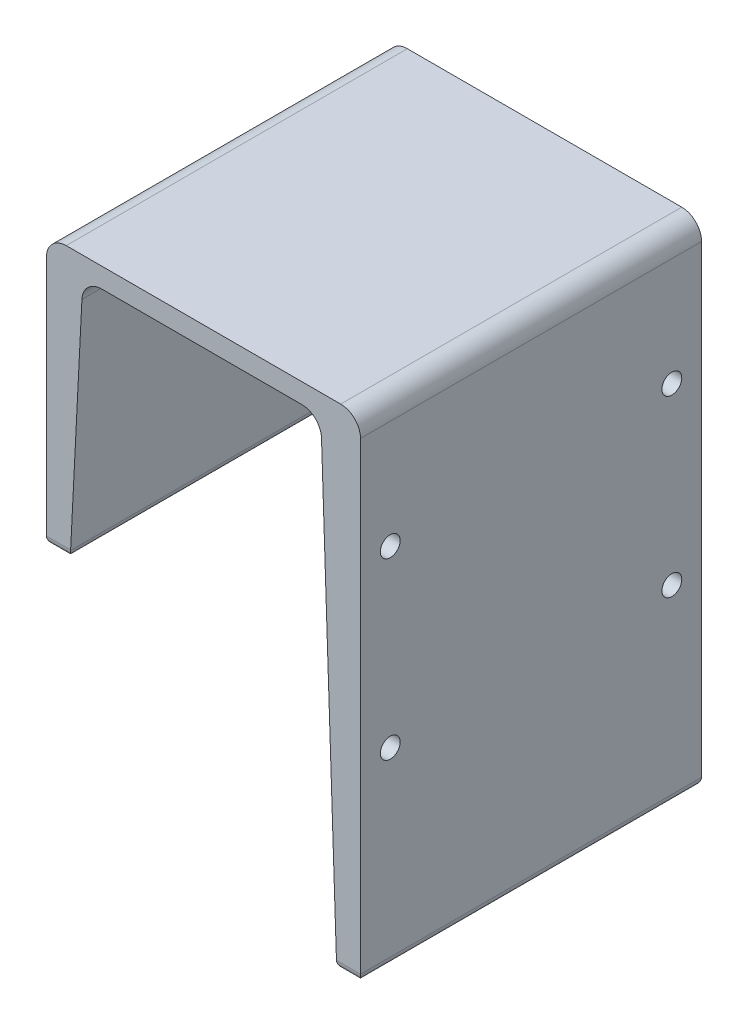
ISO-10303-21;
HEADER;
FILE_DESCRIPTION(('STEP AP214'),'2;1');
FILE_NAME('part.step','',(''),(''),'','','');
FILE_SCHEMA(('AUTOMOTIVE_DESIGN { 1 0 10303 214 1 1 1 1 }'));
ENDSEC;
DATA;
#1=APPLICATION_CONTEXT('core data for automotive mechanical design processes');
#2=APPLICATION_PROTOCOL_DEFINITION('international standard','automotive_design',2000,#1);
#3=PRODUCT_CONTEXT('',#1,'mechanical');
#4=PRODUCT('Part','Part','',(#3));
#5=PRODUCT_RELATED_PRODUCT_CATEGORY('part','',(#4));
#6=PRODUCT_DEFINITION_FORMATION('','',#4);
#7=PRODUCT_DEFINITION_CONTEXT('part definition',#1,'design');
#8=PRODUCT_DEFINITION('design','',#6,#7);
#9=PRODUCT_DEFINITION_SHAPE('','',#8);
#10=(LENGTH_UNIT() NAMED_UNIT(*) SI_UNIT(.MILLI.,.METRE.));
#11=(NAMED_UNIT(*) PLANE_ANGLE_UNIT() SI_UNIT($,.RADIAN.));
#12=(NAMED_UNIT(*) SI_UNIT($,.STERADIAN.) SOLID_ANGLE_UNIT());
#13=UNCERTAINTY_MEASURE_WITH_UNIT(LENGTH_MEASURE(1.E-05),#10,'distance_accuracy_value','');
#14=(GEOMETRIC_REPRESENTATION_CONTEXT(3) GLOBAL_UNCERTAINTY_ASSIGNED_CONTEXT((#13)) GLOBAL_UNIT_ASSIGNED_CONTEXT((#10,
#11,#12)) REPRESENTATION_CONTEXT('',''));
#15=CARTESIAN_POINT('',(0.,0.,0.));
#16=DIRECTION('',(0.,0.,1.));
#17=DIRECTION('',(1.,0.,0.));
#18=AXIS2_PLACEMENT_3D('',#15,#16,#17);
#19=CARTESIAN_POINT('',(0.,0.,-43.));
#20=DIRECTION('',(0.,-1.,0.));
#21=DIRECTION('',(1.,0.,0.));
#22=AXIS2_PLACEMENT_3D('',#19,#20,#21);
#23=PLANE('',#22);
#24=DIRECTION('',(0.,0.,1.));
#25=VECTOR('',#24,1.);
#26=CARTESIAN_POINT('',(-2.,0.,-43.));
#27=LINE('',#26,#25);
#28=CARTESIAN_POINT('',(-2.,0.,-1.));
#29=VERTEX_POINT('',#28);
#30=CARTESIAN_POINT('',(-2.,0.,-42.));
#31=VERTEX_POINT('',#30);
#32=EDGE_CURVE('E232',#29,#31,#27,.F.);
#33=ORIENTED_EDGE('',*,*,#32,.T.);
#34=DIRECTION('',(1.,0.,0.));
#35=VECTOR('',#34,1.);
#36=CARTESIAN_POINT('',(0.,0.,-42.));
#37=LINE('',#36,#35);
#38=CARTESIAN_POINT('',(-0.950432502618614,0.,-42.));
#39=VERTEX_POINT('',#38);
#40=EDGE_CURVE('E234',#31,#39,#37,.T.);
#41=ORIENTED_EDGE('',*,*,#40,.T.);
#42=DIRECTION('',(0.,0.,1.));
#43=VECTOR('',#42,1.);
#44=CARTESIAN_POINT('',(-0.950432502618614,0.,-43.));
#45=LINE('',#44,#43);
#46=CARTESIAN_POINT('',(-0.950432502618614,0.,-1.));
#47=VERTEX_POINT('',#46);
#48=EDGE_CURVE('E230',#39,#47,#45,.T.);
#49=ORIENTED_EDGE('',*,*,#48,.T.);
#50=DIRECTION('',(1.,0.,0.));
#51=VECTOR('',#50,1.);
#52=CARTESIAN_POINT('',(-3.,0.,-1.));
#53=LINE('',#52,#51);
#54=EDGE_CURVE('E228',#47,#29,#53,.F.);
#55=ORIENTED_EDGE('',*,*,#54,.T.);
#56=EDGE_LOOP('',(#33,#41,#49,#55));
#57=FACE_BOUND('',#56,.T.);
#58=ADVANCED_FACE('F37',(#57),#23,.T.);
#59=CARTESIAN_POINT('',(-3.,0.,-43.));
#60=DIRECTION('',(-1.,0.,0.));
#61=DIRECTION('',(0.,0.,1.));
#62=AXIS2_PLACEMENT_3D('',#59,#60,#61);
#63=PLANE('',#62);
#64=DIRECTION('',(0.,-1.,0.));
#65=VECTOR('',#64,1.);
#66=CARTESIAN_POINT('',(-3.,0.,-43.));
#67=LINE('',#66,#65);
#68=CARTESIAN_POINT('',(-3.,31.4588860426372,-43.));
#69=VERTEX_POINT('',#68);
#70=CARTESIAN_POINT('',(-3.,1.,-43.));
#71=VERTEX_POINT('',#70);
#72=EDGE_CURVE('E191',#69,#71,#67,.T.);
#73=ORIENTED_EDGE('',*,*,#72,.T.);
#74=DIRECTION('',(0.,0.,1.));
#75=VECTOR('',#74,1.);
#76=CARTESIAN_POINT('',(-3.,1.,-43.));
#77=LINE('',#76,#75);
#78=CARTESIAN_POINT('',(-3.,1.,0.));
#79=VERTEX_POINT('',#78);
#80=EDGE_CURVE('E246',#71,#79,#77,.T.);
#81=ORIENTED_EDGE('',*,*,#80,.T.);
#82=DIRECTION('',(0.,-1.,0.));
#83=VECTOR('',#82,1.);
#84=CARTESIAN_POINT('',(-3.,0.,0.));
#85=LINE('',#84,#83);
#86=CARTESIAN_POINT('',(-3.,31.4588860426372,0.));
#87=VERTEX_POINT('',#86);
#88=EDGE_CURVE('E199',#87,#79,#85,.T.);
#89=ORIENTED_EDGE('',*,*,#88,.F.);
#90=DIRECTION('',(0.,0.,1.));
#91=VECTOR('',#90,1.);
#92=CARTESIAN_POINT('',(-3.,31.4588860426372,-43.));
#93=LINE('',#92,#91);
#94=EDGE_CURVE('E218',#87,#69,#93,.F.);
#95=ORIENTED_EDGE('',*,*,#94,.T.);
#96=EDGE_LOOP('',(#73,#81,#89,#95));
#97=FACE_BOUND('',#96,.T.);
#98=ADVANCED_FACE('F334',(#97),#63,.T.);
#99=CARTESIAN_POINT('',(-3.,33.9588860426372,-43.));
#100=DIRECTION('',(0.,1.,0.));
#101=DIRECTION('',(0.,0.,1.));
#102=AXIS2_PLACEMENT_3D('',#99,#100,#101);
#103=PLANE('',#102);
#104=DIRECTION('',(-1.,0.,0.));
#105=VECTOR('',#104,1.);
#106=CARTESIAN_POINT('',(-3.,33.9588860426372,-43.));
#107=LINE('',#106,#105);
#108=CARTESIAN_POINT('',(34.1,33.9588860426372,-43.));
#109=VERTEX_POINT('',#108);
#110=CARTESIAN_POINT('',(-0.5,33.9588860426372,-43.));
#111=VERTEX_POINT('',#110);
#112=EDGE_CURVE('E196',#109,#111,#107,.T.);
#113=ORIENTED_EDGE('',*,*,#112,.T.);
#114=DIRECTION('',(0.,0.,1.));
#115=VECTOR('',#114,1.);
#116=CARTESIAN_POINT('',(-0.5,33.9588860426372,-43.));
#117=LINE('',#116,#115);
#118=CARTESIAN_POINT('',(-0.5,33.9588860426372,0.));
#119=VERTEX_POINT('',#118);
#120=EDGE_CURVE('E211',#111,#119,#117,.T.);
#121=ORIENTED_EDGE('',*,*,#120,.T.);
#122=DIRECTION('',(-1.,0.,0.));
#123=VECTOR('',#122,1.);
#124=CARTESIAN_POINT('',(-3.,33.9588860426372,0.));
#125=LINE('',#124,#123);
#126=CARTESIAN_POINT('',(34.1,33.9588860426372,0.));
#127=VERTEX_POINT('',#126);
#128=EDGE_CURVE('E304',#127,#119,#125,.T.);
#129=ORIENTED_EDGE('',*,*,#128,.F.);
#130=DIRECTION('',(0.,0.,1.));
#131=VECTOR('',#130,1.);
#132=CARTESIAN_POINT('',(34.1,33.9588860426372,-43.));
#133=LINE('',#132,#131);
#134=EDGE_CURVE('E209',#127,#109,#133,.F.);
#135=ORIENTED_EDGE('',*,*,#134,.T.);
#136=EDGE_LOOP('',(#113,#121,#129,#135));
#137=FACE_BOUND('',#136,.T.);
#138=ADVANCED_FACE('F325',(#137),#103,.T.);
#139=CARTESIAN_POINT('',(36.6,33.9588860426372,-43.));
#140=DIRECTION('',(1.,0.,0.));
#141=DIRECTION('',(0.,1.,0.));
#142=AXIS2_PLACEMENT_3D('',#139,#140,#141);
#143=PLANE('',#142);
#144=CARTESIAN_POINT('',(36.6,17.8190527217371,-3.75));
#145=DIRECTION('',(1.,0.,0.));
#146=DIRECTION('',(0.,-1.,0.));
#147=AXIS2_PLACEMENT_3D('',#144,#145,#146);
#148=CIRCLE('',#147,1.25);
#149=CARTESIAN_POINT('',(36.6,16.5690527217371,-3.75));
#150=VERTEX_POINT('',#149);
#151=EDGE_CURVE('E591',#150,#150,#148,.T.);
#152=ORIENTED_EDGE('',*,*,#151,.F.);
#153=EDGE_LOOP('',(#152));
#154=FACE_BOUND('',#153,.T.);
#155=CARTESIAN_POINT('',(36.6,-4.18094727826294,-3.75));
#156=DIRECTION('',(1.,0.,0.));
#157=DIRECTION('',(0.,-1.,0.));
#158=AXIS2_PLACEMENT_3D('',#155,#156,#157);
#159=CIRCLE('',#158,1.25);
#160=CARTESIAN_POINT('',(36.6,-5.43094727826295,-3.75));
#161=VERTEX_POINT('',#160);
#162=EDGE_CURVE('E599',#161,#161,#159,.T.);
#163=ORIENTED_EDGE('',*,*,#162,.F.);
#164=EDGE_LOOP('',(#163));
#165=FACE_BOUND('',#164,.T.);
#166=CARTESIAN_POINT('',(36.6,-4.18094727826294,-39.25));
#167=DIRECTION('',(1.,0.,0.));
#168=DIRECTION('',(0.,1.,0.));
#169=AXIS2_PLACEMENT_3D('',#166,#167,#168);
#170=CIRCLE('',#169,1.25);
#171=CARTESIAN_POINT('',(36.6,-2.93094727826293,-39.25));
#172=VERTEX_POINT('',#171);
#173=EDGE_CURVE('E585',#172,#172,#170,.T.);
#174=ORIENTED_EDGE('',*,*,#173,.F.);
#175=EDGE_LOOP('',(#174));
#176=FACE_BOUND('',#175,.T.);
#177=CARTESIAN_POINT('',(36.6,17.8190527217371,-39.25));
#178=DIRECTION('',(1.,0.,0.));
#179=DIRECTION('',(0.,1.,0.));
#180=AXIS2_PLACEMENT_3D('',#177,#178,#179);
#181=CIRCLE('',#180,1.25);
#182=CARTESIAN_POINT('',(36.6,19.0690527217371,-39.25));
#183=VERTEX_POINT('',#182);
#184=EDGE_CURVE('E174',#183,#183,#181,.T.);
#185=ORIENTED_EDGE('',*,*,#184,.F.);
#186=EDGE_LOOP('',(#185));
#187=FACE_BOUND('',#186,.T.);
#188=DIRECTION('',(0.,1.,0.));
#189=VECTOR('',#188,1.);
#190=CARTESIAN_POINT('',(36.6,33.9588860426372,0.));
#191=LINE('',#190,#189);
#192=CARTESIAN_POINT('',(36.6,-27.0411139573628,0.));
#193=VERTEX_POINT('',#192);
#194=CARTESIAN_POINT('',(36.6,31.4588860426372,0.));
#195=VERTEX_POINT('',#194);
#196=EDGE_CURVE('E302',#193,#195,#191,.T.);
#197=ORIENTED_EDGE('',*,*,#196,.F.);
#198=DIRECTION('',(0.,0.,1.));
#199=VECTOR('',#198,1.);
#200=CARTESIAN_POINT('',(36.6,-27.0411139573628,-43.));
#201=LINE('',#200,#199);
#202=CARTESIAN_POINT('',(36.6,-27.0411139573628,-43.));
#203=VERTEX_POINT('',#202);
#204=EDGE_CURVE('E11',#193,#203,#201,.F.);
#205=ORIENTED_EDGE('',*,*,#204,.T.);
#206=DIRECTION('',(0.,1.,0.));
#207=VECTOR('',#206,1.);
#208=CARTESIAN_POINT('',(36.6,33.9588860426372,-43.));
#209=LINE('',#208,#207);
#210=CARTESIAN_POINT('',(36.6,31.4588860426372,-43.));
#211=VERTEX_POINT('',#210);
#212=EDGE_CURVE('E319',#203,#211,#209,.T.);
#213=ORIENTED_EDGE('',*,*,#212,.T.);
#214=DIRECTION('',(0.,0.,1.));
#215=VECTOR('',#214,1.);
#216=CARTESIAN_POINT('',(36.6,31.4588860426372,-43.));
#217=LINE('',#216,#215);
#218=EDGE_CURVE('E225',#211,#195,#217,.T.);
#219=ORIENTED_EDGE('',*,*,#218,.T.);
#220=EDGE_LOOP('',(#197,#205,#213,#219));
#221=FACE_BOUND('',#220,.T.);
#222=ADVANCED_FACE('F405',(#154,#165,#176,#187,#221),#143,.T.);
#223=CARTESIAN_POINT('',(36.6,-28.0411139573628,-43.));
#224=DIRECTION('',(0.,-1.,0.));
#225=DIRECTION('',(0.,0.,-1.));
#226=AXIS2_PLACEMENT_3D('',#223,#224,#225);
#227=PLANE('',#226);
#228=DIRECTION('',(1.,0.,0.));
#229=VECTOR('',#228,1.);
#230=CARTESIAN_POINT('',(33.6,-28.0411139573628,-1.));
#231=LINE('',#230,#229);
#232=CARTESIAN_POINT('',(35.6,-28.0411139573628,-1.));
#233=VERTEX_POINT('',#232);
#234=CARTESIAN_POINT('',(34.566951326993,-28.0411139573628,-1.));
#235=VERTEX_POINT('',#234);
#236=EDGE_CURVE('E262',#233,#235,#231,.F.);
#237=ORIENTED_EDGE('',*,*,#236,.T.);
#238=DIRECTION('',(0.,0.,1.));
#239=VECTOR('',#238,1.);
#240=CARTESIAN_POINT('',(34.566951326993,-28.0411139573628,-43.));
#241=LINE('',#240,#239);
#242=CARTESIAN_POINT('',(34.566951326993,-28.0411139573628,-42.));
#243=VERTEX_POINT('',#242);
#244=EDGE_CURVE('E267',#235,#243,#241,.F.);
#245=ORIENTED_EDGE('',*,*,#244,.T.);
#246=DIRECTION('',(1.,0.,0.));
#247=VECTOR('',#246,1.);
#248=CARTESIAN_POINT('',(36.6,-28.0411139573628,-42.));
#249=LINE('',#248,#247);
#250=CARTESIAN_POINT('',(35.6,-28.0411139573628,-42.));
#251=VERTEX_POINT('',#250);
#252=EDGE_CURVE('E264',#243,#251,#249,.T.);
#253=ORIENTED_EDGE('',*,*,#252,.T.);
#254=DIRECTION('',(0.,0.,1.));
#255=VECTOR('',#254,1.);
#256=CARTESIAN_POINT('',(35.6,-28.0411139573628,-43.));
#257=LINE('',#256,#255);
#258=EDGE_CURVE('E249',#251,#233,#257,.T.);
#259=ORIENTED_EDGE('',*,*,#258,.T.);
#260=EDGE_LOOP('',(#237,#245,#253,#259));
#261=FACE_BOUND('',#260,.T.);
#262=ADVANCED_FACE('F403',(#261),#227,.T.);
#263=CARTESIAN_POINT('',(31.6,31.4588860426372,-43.));
#264=DIRECTION('',(-0.999435546416609,-0.0335944721484575,0.));
#265=DIRECTION('',(0.0335944721484575,-0.999435546416609,0.));
#266=AXIS2_PLACEMENT_3D('',#263,#264,#265);
#267=PLANE('',#266);
#268=DIRECTION('',(0.0335944721484575,-0.999435546416609,0.));
#269=VECTOR('',#268,1.);
#270=CARTESIAN_POINT('',(31.6,31.4588860426372,-43.));
#271=LINE('',#270,#269);
#272=CARTESIAN_POINT('',(31.681210548559,29.0428722230084,-43.));
#273=VERTEX_POINT('',#272);
#274=CARTESIAN_POINT('',(33.5663865546218,-27.0411139573628,-43.));
#275=VERTEX_POINT('',#274);
#276=EDGE_CURVE('E313',#273,#275,#271,.T.);
#277=ORIENTED_EDGE('',*,*,#276,.T.);
#278=CARTESIAN_POINT('',(33.5663865546218,-27.0411139573628,-42.));
#279=DIRECTION('',(-0.999435546416609,-0.0335944721484575,0.));
#280=DIRECTION('',(0.0335944721484575,-0.999435546416609,0.));
#281=AXIS2_PLACEMENT_3D('',#278,#279,#280);
#282=ELLIPSE('',#281,1.00056477237118,1.);
#283=CARTESIAN_POINT('',(33.5675157805764,-27.0747084295112,-42.9994355464166));
#284=VERTEX_POINT('',#283);
#285=EDGE_CURVE('E275',#275,#284,#282,.T.);
#286=ORIENTED_EDGE('',*,*,#285,.T.);
#287=DIRECTION('',(0.,0.,1.));
#288=VECTOR('',#287,1.);
#289=CARTESIAN_POINT('',(33.5675157805764,-27.0747084295112,-43.));
#290=LINE('',#289,#288);
#291=CARTESIAN_POINT('',(33.5675157805764,-27.0747084295112,-0.000564453583387636));
#292=VERTEX_POINT('',#291);
#293=EDGE_CURVE('E61',#284,#292,#290,.T.);
#294=ORIENTED_EDGE('',*,*,#293,.T.);
#295=CARTESIAN_POINT('',(33.5663865546218,-27.0411139573628,-1.));
#296=DIRECTION('',(-0.999435546416609,-0.0335944721484575,0.));
#297=DIRECTION('',(-0.0335944721484575,0.999435546416609,0.));
#298=AXIS2_PLACEMENT_3D('',#295,#296,#297);
#299=ELLIPSE('',#298,1.00056477237118,1.);
#300=CARTESIAN_POINT('',(33.5663865546218,-27.0411139573628,0.));
#301=VERTEX_POINT('',#300);
#302=EDGE_CURVE('E273',#292,#301,#299,.T.);
#303=ORIENTED_EDGE('',*,*,#302,.T.);
#304=DIRECTION('',(0.0335944721484575,-0.999435546416609,0.));
#305=VECTOR('',#304,1.);
#306=CARTESIAN_POINT('',(31.6,31.4588860426372,0.));
#307=LINE('',#306,#305);
#308=CARTESIAN_POINT('',(31.681210548559,29.0428722230084,0.));
#309=VERTEX_POINT('',#308);
#310=EDGE_CURVE('E300',#309,#301,#307,.T.);
#311=ORIENTED_EDGE('',*,*,#310,.F.);
#312=DIRECTION('',(0.,0.,1.));
#313=VECTOR('',#312,1.);
#314=CARTESIAN_POINT('',(31.681210548559,29.0428722230084,-43.));
#315=LINE('',#314,#313);
#316=EDGE_CURVE('E184',#309,#273,#315,.F.);
#317=ORIENTED_EDGE('',*,*,#316,.T.);
#318=EDGE_LOOP('',(#277,#286,#294,#303,#311,#317));
#319=FACE_BOUND('',#318,.T.);
#320=CARTESIAN_POINT('',(32.0584817922992,17.8190527217371,-3.75));
#321=DIRECTION('',(-0.999435546416609,-0.0335944721484575,0.));
#322=DIRECTION('',(0.0335944721484575,-0.999435546416609,0.));
#323=AXIS2_PLACEMENT_3D('',#320,#321,#322);
#324=ELLIPSE('',#323,1.25070596546398,1.25);
#325=CARTESIAN_POINT('',(32.1004985990219,16.5690527217371,-3.75));
#326=VERTEX_POINT('',#325);
#327=EDGE_CURVE('E260',#326,#326,#324,.F.);
#328=ORIENTED_EDGE('',*,*,#327,.T.);
#329=EDGE_LOOP('',(#328));
#330=FACE_BOUND('',#329,.T.);
#331=CARTESIAN_POINT('',(32.7979775906185,-4.18094727826294,-3.75));
#332=DIRECTION('',(-0.999435546416609,-0.0335944721484575,0.));
#333=DIRECTION('',(0.0335944721484575,-0.999435546416609,0.));
#334=AXIS2_PLACEMENT_3D('',#331,#332,#333);
#335=ELLIPSE('',#334,1.25070596546398,1.25);
#336=CARTESIAN_POINT('',(32.8399943973412,-5.43094727826295,-3.75));
#337=VERTEX_POINT('',#336);
#338=EDGE_CURVE('E594',#337,#337,#335,.F.);
#339=ORIENTED_EDGE('',*,*,#338,.T.);
#340=EDGE_LOOP('',(#339));
#341=FACE_BOUND('',#340,.T.);
#342=CARTESIAN_POINT('',(32.7979775906185,-4.18094727826294,-39.25));
#343=DIRECTION('',(-0.999435546416609,-0.0335944721484575,0.));
#344=DIRECTION('',(0.0335944721484575,-0.999435546416609,0.));
#345=AXIS2_PLACEMENT_3D('',#342,#343,#344);
#346=ELLIPSE('',#345,1.25070596546398,1.25);
#347=CARTESIAN_POINT('',(32.8399943973412,-5.43094727826294,-39.25));
#348=VERTEX_POINT('',#347);
#349=EDGE_CURVE('E588',#348,#348,#346,.F.);
#350=ORIENTED_EDGE('',*,*,#349,.T.);
#351=EDGE_LOOP('',(#350));
#352=FACE_BOUND('',#351,.T.);
#353=CARTESIAN_POINT('',(32.0584817922992,17.8190527217371,-39.25));
#354=DIRECTION('',(-0.999435546416609,-0.0335944721484575,0.));
#355=DIRECTION('',(0.0335944721484575,-0.999435546416609,0.));
#356=AXIS2_PLACEMENT_3D('',#353,#354,#355);
#357=ELLIPSE('',#356,1.25070596546398,1.25);
#358=CARTESIAN_POINT('',(32.1004985990219,16.5690527217371,-39.25));
#359=VERTEX_POINT('',#358);
#360=EDGE_CURVE('E581',#359,#359,#357,.F.);
#361=ORIENTED_EDGE('',*,*,#360,.T.);
#362=EDGE_LOOP('',(#361));
#363=FACE_BOUND('',#362,.T.);
#364=ADVANCED_FACE('F298',(#319,#330,#341,#352,#363),#267,.T.);
#365=CARTESIAN_POINT('',(1.6,31.4588860426372,-43.));
#366=DIRECTION('',(0.,-1.,0.));
#367=DIRECTION('',(0.,0.,-1.));
#368=AXIS2_PLACEMENT_3D('',#365,#366,#367);
#369=PLANE('',#368);
#370=DIRECTION('',(1.,0.,0.));
#371=VECTOR('',#370,1.);
#372=CARTESIAN_POINT('',(1.6,31.4588860426372,0.));
#373=LINE('',#372,#371);
#374=CARTESIAN_POINT('',(3.97608125654654,31.4588860426372,0.));
#375=VERTEX_POINT('',#374);
#376=CARTESIAN_POINT('',(29.1826216825174,31.4588860426372,0.));
#377=VERTEX_POINT('',#376);
#378=EDGE_CURVE('E173',#375,#377,#373,.T.);
#379=ORIENTED_EDGE('',*,*,#378,.F.);
#380=DIRECTION('',(0.,0.,1.));
#381=VECTOR('',#380,1.);
#382=CARTESIAN_POINT('',(3.97608125654654,31.4588860426372,-43.));
#383=LINE('',#382,#381);
#384=CARTESIAN_POINT('',(3.97608125654654,31.4588860426372,-43.));
#385=VERTEX_POINT('',#384);
#386=EDGE_CURVE('E182',#375,#385,#383,.F.);
#387=ORIENTED_EDGE('',*,*,#386,.T.);
#388=DIRECTION('',(1.,0.,0.));
#389=VECTOR('',#388,1.);
#390=CARTESIAN_POINT('',(1.6,31.4588860426372,-43.));
#391=LINE('',#390,#389);
#392=CARTESIAN_POINT('',(29.1826216825174,31.4588860426372,-43.));
#393=VERTEX_POINT('',#392);
#394=EDGE_CURVE('E310',#385,#393,#391,.T.);
#395=ORIENTED_EDGE('',*,*,#394,.T.);
#396=DIRECTION('',(0.,0.,1.));
#397=VECTOR('',#396,1.);
#398=CARTESIAN_POINT('',(29.1826216825174,31.4588860426372,0.));
#399=LINE('',#398,#397);
#400=EDGE_CURVE('E190',#393,#377,#399,.T.);
#401=ORIENTED_EDGE('',*,*,#400,.T.);
#402=EDGE_LOOP('',(#379,#387,#395,#401));
#403=FACE_BOUND('',#402,.T.);
#404=ADVANCED_FACE('F411',(#403),#369,.T.);
#405=CARTESIAN_POINT('',(0.,0.,-43.));
#406=DIRECTION('',(0.998709132311043,-0.0507943799895501,0.));
#407=DIRECTION('',(0.0507943799895501,0.998709132311043,0.));
#408=AXIS2_PLACEMENT_3D('',#405,#406,#407);
#409=PLANE('',#408);
#410=DIRECTION('',(0.,0.,1.));
#411=VECTOR('',#410,1.);
#412=CARTESIAN_POINT('',(0.048276629692429,0.94920562001045,-43.));
#413=LINE('',#412,#411);
#414=CARTESIAN_POINT('',(0.048276629692429,0.94920562001045,-0.00129086768895642));
#415=VERTEX_POINT('',#414);
#416=CARTESIAN_POINT('',(0.048276629692429,0.94920562001045,-42.998709132311));
#417=VERTEX_POINT('',#416);
#418=EDGE_CURVE('E239',#415,#417,#413,.F.);
#419=ORIENTED_EDGE('',*,*,#418,.T.);
#420=CARTESIAN_POINT('',(0.0508600335635365,1.,-42.));
#421=DIRECTION('',(0.998709132311043,-0.0507943799895501,0.));
#422=DIRECTION('',(0.0507943799895501,0.998709132311043,0.));
#423=AXIS2_PLACEMENT_3D('',#420,#421,#422);
#424=ELLIPSE('',#423,1.00129253618215,1.);
#425=CARTESIAN_POINT('',(0.0508600335635365,1.,-43.));
#426=VERTEX_POINT('',#425);
#427=EDGE_CURVE('E241',#417,#426,#424,.T.);
#428=ORIENTED_EDGE('',*,*,#427,.T.);
#429=DIRECTION('',(0.0507943799895501,0.998709132311044,0.));
#430=VECTOR('',#429,1.);
#431=CARTESIAN_POINT('',(0.,0.,-43.));
#432=LINE('',#431,#430);
#433=CARTESIAN_POINT('',(1.47930842576893,29.0858719926111,-43.));
#434=VERTEX_POINT('',#433);
#435=EDGE_CURVE('E188',#426,#434,#432,.T.);
#436=ORIENTED_EDGE('',*,*,#435,.T.);
#437=DIRECTION('',(0.,0.,1.));
#438=VECTOR('',#437,1.);
#439=CARTESIAN_POINT('',(1.47930842576893,29.0858719926111,0.));
#440=LINE('',#439,#438);
#441=CARTESIAN_POINT('',(1.47930842576893,29.0858719926111,0.));
#442=VERTEX_POINT('',#441);
#443=EDGE_CURVE('E181',#434,#442,#440,.T.);
#444=ORIENTED_EDGE('',*,*,#443,.T.);
#445=DIRECTION('',(0.0507943799895501,0.998709132311044,0.));
#446=VECTOR('',#445,1.);
#447=CARTESIAN_POINT('',(0.,0.,0.));
#448=LINE('',#447,#446);
#449=CARTESIAN_POINT('',(0.0508600335635365,1.,0.));
#450=VERTEX_POINT('',#449);
#451=EDGE_CURVE('E161',#450,#442,#448,.T.);
#452=ORIENTED_EDGE('',*,*,#451,.F.);
#453=CARTESIAN_POINT('',(0.0508600335635365,1.,-1.));
#454=DIRECTION('',(0.998709132311043,-0.0507943799895501,0.));
#455=DIRECTION('',(-0.0507943799895501,-0.998709132311043,0.));
#456=AXIS2_PLACEMENT_3D('',#453,#454,#455);
#457=ELLIPSE('',#456,1.00129253618215,1.);
#458=EDGE_CURVE('E237',#450,#415,#457,.T.);
#459=ORIENTED_EDGE('',*,*,#458,.T.);
#460=EDGE_LOOP('',(#419,#428,#436,#444,#452,#459));
#461=FACE_BOUND('',#460,.T.);
#462=ADVANCED_FACE('F186',(#461),#409,.T.);
#463=CARTESIAN_POINT('',(0.,0.,-43.));
#464=DIRECTION('',(0.,0.,-1.));
#465=DIRECTION('',(-1.,0.,0.));
#466=AXIS2_PLACEMENT_3D('',#463,#464,#465);
#467=PLANE('',#466);
#468=ORIENTED_EDGE('',*,*,#212,.F.);
#469=DIRECTION('',(1.,0.,0.));
#470=VECTOR('',#469,1.);
#471=CARTESIAN_POINT('',(0.,-27.0411139573628,-43.));
#472=LINE('',#471,#470);
#473=EDGE_CURVE('E269',#203,#275,#472,.F.);
#474=ORIENTED_EDGE('',*,*,#473,.T.);
#475=ORIENTED_EDGE('',*,*,#276,.F.);
#476=CARTESIAN_POINT('',(29.1826216825174,28.9588860426372,-43.));
#477=DIRECTION('',(0.,0.,-1.));
#478=DIRECTION('',(-1.,0.,0.));
#479=AXIS2_PLACEMENT_3D('',#476,#477,#478);
#480=CIRCLE('',#479,2.5);
#481=EDGE_CURVE('E207',#273,#393,#480,.F.);
#482=ORIENTED_EDGE('',*,*,#481,.T.);
#483=ORIENTED_EDGE('',*,*,#394,.F.);
#484=CARTESIAN_POINT('',(3.97608125654654,28.9588860426372,-43.));
#485=DIRECTION('',(0.,0.,-1.));
#486=DIRECTION('',(-1.,0.,0.));
#487=AXIS2_PLACEMENT_3D('',#484,#485,#486);
#488=CIRCLE('',#487,2.5);
#489=EDGE_CURVE('E183',#385,#434,#488,.F.);
#490=ORIENTED_EDGE('',*,*,#489,.T.);
#491=ORIENTED_EDGE('',*,*,#435,.F.);
#492=DIRECTION('',(1.,0.,0.));
#493=VECTOR('',#492,1.);
#494=CARTESIAN_POINT('',(0.,1.,-43.));
#495=LINE('',#494,#493);
#496=EDGE_CURVE('E243',#426,#71,#495,.F.);
#497=ORIENTED_EDGE('',*,*,#496,.T.);
#498=ORIENTED_EDGE('',*,*,#72,.F.);
#499=CARTESIAN_POINT('',(-0.5,31.4588860426372,-43.));
#500=DIRECTION('',(0.,0.,-1.));
#501=DIRECTION('',(-1.,0.,0.));
#502=AXIS2_PLACEMENT_3D('',#499,#500,#501);
#503=CIRCLE('',#502,2.5);
#504=EDGE_CURVE('E223',#69,#111,#503,.T.);
#505=ORIENTED_EDGE('',*,*,#504,.T.);
#506=ORIENTED_EDGE('',*,*,#112,.F.);
#507=CARTESIAN_POINT('',(34.1,31.4588860426372,-43.));
#508=DIRECTION('',(0.,0.,-1.));
#509=DIRECTION('',(-1.,0.,0.));
#510=AXIS2_PLACEMENT_3D('',#507,#508,#509);
#511=CIRCLE('',#510,2.5);
#512=EDGE_CURVE('E220',#109,#211,#511,.T.);
#513=ORIENTED_EDGE('',*,*,#512,.T.);
#514=EDGE_LOOP('',(#468,#474,#475,#482,#483,#490,#491,#497,#498,#505,#506,#513));
#515=FACE_BOUND('',#514,.T.);
#516=ADVANCED_FACE('F345',(#515),#467,.T.);
#517=CARTESIAN_POINT('',(0.,0.,0.));
#518=DIRECTION('',(0.,0.,-1.));
#519=DIRECTION('',(-1.,0.,0.));
#520=AXIS2_PLACEMENT_3D('',#517,#518,#519);
#521=PLANE('',#520);
#522=ORIENTED_EDGE('',*,*,#310,.T.);
#523=DIRECTION('',(1.,0.,0.));
#524=VECTOR('',#523,1.);
#525=CARTESIAN_POINT('',(36.6,-27.0411139573628,0.));
#526=LINE('',#525,#524);
#527=EDGE_CURVE('E46',#301,#193,#526,.T.);
#528=ORIENTED_EDGE('',*,*,#527,.T.);
#529=ORIENTED_EDGE('',*,*,#196,.T.);
#530=CARTESIAN_POINT('',(34.1,31.4588860426372,0.));
#531=DIRECTION('',(0.,0.,-1.));
#532=DIRECTION('',(-1.,0.,0.));
#533=AXIS2_PLACEMENT_3D('',#530,#531,#532);
#534=CIRCLE('',#533,2.5);
#535=EDGE_CURVE('E214',#195,#127,#534,.F.);
#536=ORIENTED_EDGE('',*,*,#535,.T.);
#537=ORIENTED_EDGE('',*,*,#128,.T.);
#538=CARTESIAN_POINT('',(-0.5,31.4588860426372,0.));
#539=DIRECTION('',(0.,0.,-1.));
#540=DIRECTION('',(-1.,0.,0.));
#541=AXIS2_PLACEMENT_3D('',#538,#539,#540);
#542=CIRCLE('',#541,2.5);
#543=EDGE_CURVE('E216',#119,#87,#542,.F.);
#544=ORIENTED_EDGE('',*,*,#543,.T.);
#545=ORIENTED_EDGE('',*,*,#88,.T.);
#546=DIRECTION('',(1.,0.,0.));
#547=VECTOR('',#546,1.);
#548=CARTESIAN_POINT('',(0.,1.,0.));
#549=LINE('',#548,#547);
#550=EDGE_CURVE('E169',#79,#450,#549,.T.);
#551=ORIENTED_EDGE('',*,*,#550,.T.);
#552=ORIENTED_EDGE('',*,*,#451,.T.);
#553=CARTESIAN_POINT('',(3.97608125654654,28.9588860426372,0.));
#554=DIRECTION('',(0.,0.,-1.));
#555=DIRECTION('',(-1.,0.,0.));
#556=AXIS2_PLACEMENT_3D('',#553,#554,#555);
#557=CIRCLE('',#556,2.5);
#558=EDGE_CURVE('E165',#442,#375,#557,.T.);
#559=ORIENTED_EDGE('',*,*,#558,.T.);
#560=ORIENTED_EDGE('',*,*,#378,.T.);
#561=CARTESIAN_POINT('',(29.1826216825174,28.9588860426372,0.));
#562=DIRECTION('',(0.,0.,-1.));
#563=DIRECTION('',(-1.,0.,0.));
#564=AXIS2_PLACEMENT_3D('',#561,#562,#563);
#565=CIRCLE('',#564,2.5);
#566=EDGE_CURVE('E205',#377,#309,#565,.T.);
#567=ORIENTED_EDGE('',*,*,#566,.T.);
#568=EDGE_LOOP('',(#522,#528,#529,#536,#537,#544,#545,#551,#552,#559,#560,#567));
#569=FACE_BOUND('',#568,.T.);
#570=ADVANCED_FACE('F163',(#569),#521,.F.);
#571=CARTESIAN_POINT('',(-3.00100000000001,17.8190527217371,-39.25));
#572=DIRECTION('',(1.,0.,0.));
#573=DIRECTION('',(0.,1.,0.));
#574=AXIS2_PLACEMENT_3D('',#571,#572,#573);
#575=CYLINDRICAL_SURFACE('',#574,1.25);
#576=ORIENTED_EDGE('',*,*,#360,.F.);
#577=EDGE_LOOP('',(#576));
#578=FACE_BOUND('',#577,.T.);
#579=ORIENTED_EDGE('',*,*,#184,.T.);
#580=EDGE_LOOP('',(#579));
#581=FACE_BOUND('',#580,.T.);
#582=ADVANCED_FACE('F431',(#578,#581),#575,.F.);
#583=CARTESIAN_POINT('',(-3.00100000000001,-4.18094727826294,-39.25));
#584=DIRECTION('',(1.,0.,0.));
#585=DIRECTION('',(0.,1.,0.));
#586=AXIS2_PLACEMENT_3D('',#583,#584,#585);
#587=CYLINDRICAL_SURFACE('',#586,1.25);
#588=ORIENTED_EDGE('',*,*,#349,.F.);
#589=EDGE_LOOP('',(#588));
#590=FACE_BOUND('',#589,.T.);
#591=ORIENTED_EDGE('',*,*,#173,.T.);
#592=EDGE_LOOP('',(#591));
#593=FACE_BOUND('',#592,.T.);
#594=ADVANCED_FACE('F555',(#590,#593),#587,.F.);
#595=CARTESIAN_POINT('',(-3.00100000000001,-4.18094727826295,-3.75));
#596=DIRECTION('',(1.,0.,0.));
#597=DIRECTION('',(0.,1.,0.));
#598=AXIS2_PLACEMENT_3D('',#595,#596,#597);
#599=CYLINDRICAL_SURFACE('',#598,1.25);
#600=ORIENTED_EDGE('',*,*,#338,.F.);
#601=EDGE_LOOP('',(#600));
#602=FACE_BOUND('',#601,.T.);
#603=ORIENTED_EDGE('',*,*,#162,.T.);
#604=EDGE_LOOP('',(#603));
#605=FACE_BOUND('',#604,.T.);
#606=ADVANCED_FACE('F547',(#602,#605),#599,.F.);
#607=CARTESIAN_POINT('',(-3.00100000000001,17.8190527217371,-3.75));
#608=DIRECTION('',(1.,0.,0.));
#609=DIRECTION('',(0.,1.,0.));
#610=AXIS2_PLACEMENT_3D('',#607,#608,#609);
#611=CYLINDRICAL_SURFACE('',#610,1.25);
#612=ORIENTED_EDGE('',*,*,#327,.F.);
#613=EDGE_LOOP('',(#612));
#614=FACE_BOUND('',#613,.T.);
#615=ORIENTED_EDGE('',*,*,#151,.T.);
#616=EDGE_LOOP('',(#615));
#617=FACE_BOUND('',#616,.T.);
#618=ADVANCED_FACE('F379',(#614,#617),#611,.F.);
#619=CARTESIAN_POINT('',(3.97608125654654,28.9588860426372,-43.));
#620=DIRECTION('',(0.,0.,-1.));
#621=DIRECTION('',(-1.,0.,0.));
#622=AXIS2_PLACEMENT_3D('',#619,#620,#621);
#623=CYLINDRICAL_SURFACE('',#622,2.5);
#624=ORIENTED_EDGE('',*,*,#489,.F.);
#625=ORIENTED_EDGE('',*,*,#386,.F.);
#626=ORIENTED_EDGE('',*,*,#558,.F.);
#627=ORIENTED_EDGE('',*,*,#443,.F.);
#628=EDGE_LOOP('',(#624,#625,#626,#627));
#629=FACE_BOUND('',#628,.T.);
#630=ADVANCED_FACE('F180',(#629),#623,.F.);
#631=CARTESIAN_POINT('',(29.1826216825174,28.9588860426372,-43.));
#632=DIRECTION('',(0.,0.,-1.));
#633=DIRECTION('',(-1.,0.,0.));
#634=AXIS2_PLACEMENT_3D('',#631,#632,#633);
#635=CYLINDRICAL_SURFACE('',#634,2.5);
#636=ORIENTED_EDGE('',*,*,#481,.F.);
#637=ORIENTED_EDGE('',*,*,#316,.F.);
#638=ORIENTED_EDGE('',*,*,#566,.F.);
#639=ORIENTED_EDGE('',*,*,#400,.F.);
#640=EDGE_LOOP('',(#636,#637,#638,#639));
#641=FACE_BOUND('',#640,.T.);
#642=ADVANCED_FACE('F378',(#641),#635,.F.);
#643=CARTESIAN_POINT('',(-0.5,31.4588860426372,-43.));
#644=DIRECTION('',(0.,0.,1.));
#645=DIRECTION('',(1.,0.,0.));
#646=AXIS2_PLACEMENT_3D('',#643,#644,#645);
#647=CYLINDRICAL_SURFACE('',#646,2.5);
#648=ORIENTED_EDGE('',*,*,#504,.F.);
#649=ORIENTED_EDGE('',*,*,#94,.F.);
#650=ORIENTED_EDGE('',*,*,#543,.F.);
#651=ORIENTED_EDGE('',*,*,#120,.F.);
#652=EDGE_LOOP('',(#648,#649,#650,#651));
#653=FACE_BOUND('',#652,.T.);
#654=ADVANCED_FACE('F331',(#653),#647,.T.);
#655=CARTESIAN_POINT('',(34.1,31.4588860426372,-43.));
#656=DIRECTION('',(0.,0.,1.));
#657=DIRECTION('',(1.,0.,0.));
#658=AXIS2_PLACEMENT_3D('',#655,#656,#657);
#659=CYLINDRICAL_SURFACE('',#658,2.5);
#660=ORIENTED_EDGE('',*,*,#512,.F.);
#661=ORIENTED_EDGE('',*,*,#134,.F.);
#662=ORIENTED_EDGE('',*,*,#535,.F.);
#663=ORIENTED_EDGE('',*,*,#218,.F.);
#664=EDGE_LOOP('',(#660,#661,#662,#663));
#665=FACE_BOUND('',#664,.T.);
#666=ADVANCED_FACE('F385',(#665),#659,.T.);
#667=CARTESIAN_POINT('',(0.,1.,-1.));
#668=DIRECTION('',(-1.,0.,0.));
#669=DIRECTION('',(0.,-1.,0.));
#670=AXIS2_PLACEMENT_3D('',#667,#668,#669);
#671=CYLINDRICAL_SURFACE('',#670,1.);
#672=ORIENTED_EDGE('',*,*,#458,.F.);
#673=ORIENTED_EDGE('',*,*,#550,.F.);
#674=CARTESIAN_POINT('',(-2.,1.,-1.));
#675=DIRECTION('',(-0.707106781186547,0.,-0.707106781186547));
#676=DIRECTION('',(-0.707106781186547,0.,0.707106781186547));
#677=AXIS2_PLACEMENT_3D('',#674,#675,#676);
#678=ELLIPSE('',#677,1.41421356237309,1.);
#679=EDGE_CURVE('E257',#29,#79,#678,.T.);
#680=ORIENTED_EDGE('',*,*,#679,.F.);
#681=ORIENTED_EDGE('',*,*,#54,.F.);
#682=CARTESIAN_POINT('',(-0.950432502618614,1.,-1.));
#683=DIRECTION('',(-0.707106781186547,0.,0.707106781186547));
#684=DIRECTION('',(-0.707106781186547,0.,-0.707106781186547));
#685=AXIS2_PLACEMENT_3D('',#682,#683,#684);
#686=ELLIPSE('',#685,1.41421356237309,1.);
#687=EDGE_CURVE('E254',#415,#47,#686,.F.);
#688=ORIENTED_EDGE('',*,*,#687,.F.);
#689=EDGE_LOOP('',(#672,#673,#680,#681,#688));
#690=FACE_BOUND('',#689,.T.);
#691=ADVANCED_FACE('F355',(#690),#671,.T.);
#692=CARTESIAN_POINT('',(-2.,1.,-43.));
#693=DIRECTION('',(0.,0.,1.));
#694=DIRECTION('',(1.,0.,0.));
#695=AXIS2_PLACEMENT_3D('',#692,#693,#694);
#696=CYLINDRICAL_SURFACE('',#695,1.);
#697=ORIENTED_EDGE('',*,*,#679,.T.);
#698=ORIENTED_EDGE('',*,*,#80,.F.);
#699=CARTESIAN_POINT('',(-2.,1.,-42.));
#700=DIRECTION('',(-0.707106781186547,0.,0.707106781186547));
#701=DIRECTION('',(0.707106781186547,0.,0.707106781186547));
#702=AXIS2_PLACEMENT_3D('',#699,#700,#701);
#703=ELLIPSE('',#702,1.41421356237309,1.);
#704=EDGE_CURVE('E252',#31,#71,#703,.F.);
#705=ORIENTED_EDGE('',*,*,#704,.F.);
#706=ORIENTED_EDGE('',*,*,#32,.F.);
#707=EDGE_LOOP('',(#697,#698,#705,#706));
#708=FACE_BOUND('',#707,.T.);
#709=ADVANCED_FACE('F339',(#708),#696,.T.);
#710=CARTESIAN_POINT('',(-0.950432502618614,1.,-43.));
#711=DIRECTION('',(0.,0.,1.));
#712=DIRECTION('',(1.,0.,0.));
#713=AXIS2_PLACEMENT_3D('',#710,#711,#712);
#714=CYLINDRICAL_SURFACE('',#713,1.);
#715=ORIENTED_EDGE('',*,*,#687,.T.);
#716=ORIENTED_EDGE('',*,*,#48,.F.);
#717=CARTESIAN_POINT('',(-0.950432502618614,1.,-42.));
#718=DIRECTION('',(0.707106781186547,0.,0.707106781186547));
#719=DIRECTION('',(-0.707106781186547,0.,0.707106781186547));
#720=AXIS2_PLACEMENT_3D('',#717,#718,#719);
#721=ELLIPSE('',#720,1.41421356237309,1.);
#722=EDGE_CURVE('E250',#417,#39,#721,.F.);
#723=ORIENTED_EDGE('',*,*,#722,.F.);
#724=ORIENTED_EDGE('',*,*,#418,.F.);
#725=EDGE_LOOP('',(#715,#716,#723,#724));
#726=FACE_BOUND('',#725,.T.);
#727=ADVANCED_FACE('F358',(#726),#714,.T.);
#728=CARTESIAN_POINT('',(0.,1.,-42.));
#729=DIRECTION('',(1.,0.,0.));
#730=DIRECTION('',(0.,1.,0.));
#731=AXIS2_PLACEMENT_3D('',#728,#729,#730);
#732=CYLINDRICAL_SURFACE('',#731,1.);
#733=ORIENTED_EDGE('',*,*,#704,.T.);
#734=ORIENTED_EDGE('',*,*,#496,.F.);
#735=ORIENTED_EDGE('',*,*,#427,.F.);
#736=ORIENTED_EDGE('',*,*,#722,.T.);
#737=ORIENTED_EDGE('',*,*,#40,.F.);
#738=EDGE_LOOP('',(#733,#734,#735,#736,#737));
#739=FACE_BOUND('',#738,.T.);
#740=ADVANCED_FACE('F348',(#739),#732,.T.);
#741=CARTESIAN_POINT('',(0.,-27.0411139573628,-1.));
#742=DIRECTION('',(-1.,0.,0.));
#743=DIRECTION('',(0.,0.,1.));
#744=AXIS2_PLACEMENT_3D('',#741,#742,#743);
#745=CYLINDRICAL_SURFACE('',#744,1.);
#746=ORIENTED_EDGE('',*,*,#527,.F.);
#747=ORIENTED_EDGE('',*,*,#302,.F.);
#748=CARTESIAN_POINT('',(34.566951326993,-27.0411139573628,-1.));
#749=DIRECTION('',(0.707106781186548,0.,0.707106781186547));
#750=DIRECTION('',(-0.707106781186548,0.,0.707106781186547));
#751=AXIS2_PLACEMENT_3D('',#748,#749,#750);
#752=ELLIPSE('',#751,1.41421356237309,1.);
#753=EDGE_CURVE('E41',#235,#292,#752,.F.);
#754=ORIENTED_EDGE('',*,*,#753,.F.);
#755=ORIENTED_EDGE('',*,*,#236,.F.);
#756=CARTESIAN_POINT('',(35.6,-27.0411139573628,-1.));
#757=DIRECTION('',(-0.707106781186547,0.,0.707106781186547));
#758=DIRECTION('',(0.707106781186547,0.,0.707106781186547));
#759=AXIS2_PLACEMENT_3D('',#756,#757,#758);
#760=ELLIPSE('',#759,1.41421356237309,1.);
#761=EDGE_CURVE('E282',#193,#233,#760,.F.);
#762=ORIENTED_EDGE('',*,*,#761,.F.);
#763=EDGE_LOOP('',(#746,#747,#754,#755,#762));
#764=FACE_BOUND('',#763,.T.);
#765=ADVANCED_FACE('F39',(#764),#745,.T.);
#766=CARTESIAN_POINT('',(34.566951326993,-27.0411139573628,-43.));
#767=DIRECTION('',(0.,0.,1.));
#768=DIRECTION('',(1.,0.,0.));
#769=AXIS2_PLACEMENT_3D('',#766,#767,#768);
#770=CYLINDRICAL_SURFACE('',#769,1.);
#771=ORIENTED_EDGE('',*,*,#753,.T.);
#772=ORIENTED_EDGE('',*,*,#293,.F.);
#773=CARTESIAN_POINT('',(34.566951326993,-27.0411139573628,-42.));
#774=DIRECTION('',(-0.707106781186548,0.,0.707106781186547));
#775=DIRECTION('',(0.707106781186548,0.,0.707106781186547));
#776=AXIS2_PLACEMENT_3D('',#773,#774,#775);
#777=ELLIPSE('',#776,1.41421356237309,1.);
#778=EDGE_CURVE('E280',#243,#284,#777,.F.);
#779=ORIENTED_EDGE('',*,*,#778,.F.);
#780=ORIENTED_EDGE('',*,*,#244,.F.);
#781=EDGE_LOOP('',(#771,#772,#779,#780));
#782=FACE_BOUND('',#781,.T.);
#783=ADVANCED_FACE('F292',(#782),#770,.T.);
#784=CARTESIAN_POINT('',(35.6,-27.0411139573628,-43.));
#785=DIRECTION('',(0.,0.,1.));
#786=DIRECTION('',(1.,0.,0.));
#787=AXIS2_PLACEMENT_3D('',#784,#785,#786);
#788=CYLINDRICAL_SURFACE('',#787,1.);
#789=ORIENTED_EDGE('',*,*,#761,.T.);
#790=ORIENTED_EDGE('',*,*,#258,.F.);
#791=CARTESIAN_POINT('',(35.6,-27.0411139573628,-42.));
#792=DIRECTION('',(0.707106781186547,0.,0.707106781186547));
#793=DIRECTION('',(-0.707106781186547,0.,0.707106781186547));
#794=AXIS2_PLACEMENT_3D('',#791,#792,#793);
#795=ELLIPSE('',#794,1.41421356237309,1.);
#796=EDGE_CURVE('E278',#203,#251,#795,.F.);
#797=ORIENTED_EDGE('',*,*,#796,.F.);
#798=ORIENTED_EDGE('',*,*,#204,.F.);
#799=EDGE_LOOP('',(#789,#790,#797,#798));
#800=FACE_BOUND('',#799,.T.);
#801=ADVANCED_FACE('F401',(#800),#788,.T.);
#802=CARTESIAN_POINT('',(36.6,-27.0411139573628,-42.));
#803=DIRECTION('',(1.,0.,0.));
#804=DIRECTION('',(0.,0.,-1.));
#805=AXIS2_PLACEMENT_3D('',#802,#803,#804);
#806=CYLINDRICAL_SURFACE('',#805,1.);
#807=ORIENTED_EDGE('',*,*,#285,.F.);
#808=ORIENTED_EDGE('',*,*,#473,.F.);
#809=ORIENTED_EDGE('',*,*,#796,.T.);
#810=ORIENTED_EDGE('',*,*,#252,.F.);
#811=ORIENTED_EDGE('',*,*,#778,.T.);
#812=EDGE_LOOP('',(#807,#808,#809,#810,#811));
#813=FACE_BOUND('',#812,.T.);
#814=ADVANCED_FACE('F399',(#813),#806,.T.);
#815=CLOSED_SHELL('',(#58,#98,#138,#222,#262,#364,#404,#462,#516,#570,#582,#594,#606,#618,#630,
#642,#654,#666,#691,#709,#727,#740,#765,#783,#801,#814));
#816=MANIFOLD_SOLID_BREP('B2',#815);
#817=ADVANCED_BREP_SHAPE_REPRESENTATION('',(#18,#816),#14);
#818=SHAPE_DEFINITION_REPRESENTATION(#9,#817);
ENDSEC;
END-ISO-10303-21;
